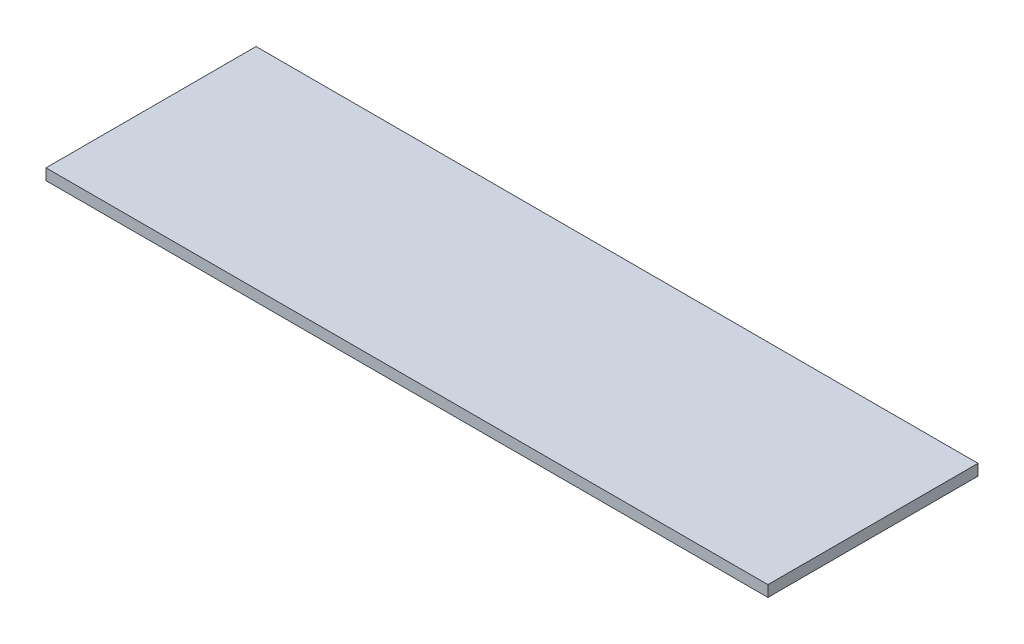
ISO-10303-21;
HEADER;
FILE_DESCRIPTION(('STEP AP214'),'2;1');
FILE_NAME('part.step','',(''),(''),'','','');
FILE_SCHEMA(('AUTOMOTIVE_DESIGN { 1 0 10303 214 1 1 1 1 }'));
ENDSEC;
DATA;
#1=APPLICATION_CONTEXT('core data for automotive mechanical design processes');
#2=APPLICATION_PROTOCOL_DEFINITION('international standard','automotive_design',2000,#1);
#3=PRODUCT_CONTEXT('',#1,'mechanical');
#4=PRODUCT('Part','Part','',(#3));
#5=PRODUCT_RELATED_PRODUCT_CATEGORY('part','',(#4));
#6=PRODUCT_DEFINITION_FORMATION('','',#4);
#7=PRODUCT_DEFINITION_CONTEXT('part definition',#1,'design');
#8=PRODUCT_DEFINITION('design','',#6,#7);
#9=PRODUCT_DEFINITION_SHAPE('','',#8);
#10=(LENGTH_UNIT() NAMED_UNIT(*) SI_UNIT(.MILLI.,.METRE.));
#11=(NAMED_UNIT(*) PLANE_ANGLE_UNIT() SI_UNIT($,.RADIAN.));
#12=(NAMED_UNIT(*) SI_UNIT($,.STERADIAN.) SOLID_ANGLE_UNIT());
#13=UNCERTAINTY_MEASURE_WITH_UNIT(LENGTH_MEASURE(1.E-05),#10,'distance_accuracy_value','');
#14=(GEOMETRIC_REPRESENTATION_CONTEXT(3) GLOBAL_UNCERTAINTY_ASSIGNED_CONTEXT((#13)) GLOBAL_UNIT_ASSIGNED_CONTEXT((#10,
#11,#12)) REPRESENTATION_CONTEXT('',''));
#15=CARTESIAN_POINT('',(0.,0.,0.));
#16=DIRECTION('',(0.,0.,1.));
#17=DIRECTION('',(1.,0.,0.));
#18=AXIS2_PLACEMENT_3D('',#15,#16,#17);
#19=CARTESIAN_POINT('',(-59.1289481870498,4.7625,-61.5154815794485));
#20=DIRECTION('',(1.,0.,0.));
#21=DIRECTION('',(0.,0.,-1.));
#22=AXIS2_PLACEMENT_3D('',#19,#20,#21);
#23=PLANE('',#22);
#24=DIRECTION('',(0.,0.,1.));
#25=VECTOR('',#24,1.);
#26=CARTESIAN_POINT('',(-59.1289481870498,0.,-61.5154815794485));
#27=LINE('',#26,#25);
#28=CARTESIAN_POINT('',(-59.1289481870498,0.,-61.5154815794485));
#29=VERTEX_POINT('',#28);
#30=CARTESIAN_POINT('',(-59.1289481870498,0.,28.4005184205515));
#31=VERTEX_POINT('',#30);
#32=EDGE_CURVE('E98',#29,#31,#27,.T.);
#33=ORIENTED_EDGE('',*,*,#32,.T.);
#34=DIRECTION('',(0.,-1.,0.));
#35=VECTOR('',#34,1.);
#36=CARTESIAN_POINT('',(-59.1289481870498,4.7625,28.4005184205515));
#37=LINE('',#36,#35);
#38=CARTESIAN_POINT('',(-59.1289481870498,4.7625,28.4005184205515));
#39=VERTEX_POINT('',#38);
#40=EDGE_CURVE('E11',#39,#31,#37,.T.);
#41=ORIENTED_EDGE('',*,*,#40,.F.);
#42=DIRECTION('',(0.,0.,1.));
#43=VECTOR('',#42,1.);
#44=CARTESIAN_POINT('',(-59.1289481870498,4.7625,-61.5154815794485));
#45=LINE('',#44,#43);
#46=CARTESIAN_POINT('',(-59.1289481870498,4.7625,-61.5154815794485));
#47=VERTEX_POINT('',#46);
#48=EDGE_CURVE('E86',#47,#39,#45,.T.);
#49=ORIENTED_EDGE('',*,*,#48,.F.);
#50=DIRECTION('',(0.,-1.,0.));
#51=VECTOR('',#50,1.);
#52=CARTESIAN_POINT('',(-59.1289481870498,4.7625,-61.5154815794485));
#53=LINE('',#52,#51);
#54=EDGE_CURVE('E94',#47,#29,#53,.T.);
#55=ORIENTED_EDGE('',*,*,#54,.T.);
#56=EDGE_LOOP('',(#33,#41,#49,#55));
#57=FACE_BOUND('',#56,.T.);
#58=ADVANCED_FACE('F35',(#57),#23,.F.);
#59=CARTESIAN_POINT('',(-59.1289481870498,4.7625,28.4005184205515));
#60=DIRECTION('',(0.,0.,-1.));
#61=DIRECTION('',(-1.,0.,0.));
#62=AXIS2_PLACEMENT_3D('',#59,#60,#61);
#63=PLANE('',#62);
#64=DIRECTION('',(1.,0.,0.));
#65=VECTOR('',#64,1.);
#66=CARTESIAN_POINT('',(-59.1289481870498,0.,28.4005184205515));
#67=LINE('',#66,#65);
#68=CARTESIAN_POINT('',(249.87105181295,0.,28.4005184205515));
#69=VERTEX_POINT('',#68);
#70=EDGE_CURVE('E90',#31,#69,#67,.T.);
#71=ORIENTED_EDGE('',*,*,#70,.T.);
#72=DIRECTION('',(0.,-1.,0.));
#73=VECTOR('',#72,1.);
#74=CARTESIAN_POINT('',(249.87105181295,4.7625,28.4005184205515));
#75=LINE('',#74,#73);
#76=CARTESIAN_POINT('',(249.87105181295,4.7625,28.4005184205515));
#77=VERTEX_POINT('',#76);
#78=EDGE_CURVE('E43',#77,#69,#75,.T.);
#79=ORIENTED_EDGE('',*,*,#78,.F.);
#80=DIRECTION('',(1.,0.,0.));
#81=VECTOR('',#80,1.);
#82=CARTESIAN_POINT('',(-59.1289481870498,4.7625,28.4005184205515));
#83=LINE('',#82,#81);
#84=EDGE_CURVE('E81',#39,#77,#83,.T.);
#85=ORIENTED_EDGE('',*,*,#84,.F.);
#86=ORIENTED_EDGE('',*,*,#40,.T.);
#87=EDGE_LOOP('',(#71,#79,#85,#86));
#88=FACE_BOUND('',#87,.T.);
#89=ADVANCED_FACE('F89',(#88),#63,.F.);
#90=CARTESIAN_POINT('',(249.87105181295,4.7625,-61.5154815794485));
#91=DIRECTION('',(-1.,0.,0.));
#92=DIRECTION('',(0.,0.,1.));
#93=AXIS2_PLACEMENT_3D('',#90,#91,#92);
#94=PLANE('',#93);
#95=DIRECTION('',(0.,0.,-1.));
#96=VECTOR('',#95,1.);
#97=CARTESIAN_POINT('',(249.87105181295,0.,-61.5154815794485));
#98=LINE('',#97,#96);
#99=CARTESIAN_POINT('',(249.87105181295,0.,-61.5154815794485));
#100=VERTEX_POINT('',#99);
#101=EDGE_CURVE('E68',#69,#100,#98,.T.);
#102=ORIENTED_EDGE('',*,*,#101,.T.);
#103=DIRECTION('',(0.,-1.,0.));
#104=VECTOR('',#103,1.);
#105=CARTESIAN_POINT('',(249.87105181295,4.7625,-61.5154815794485));
#106=LINE('',#105,#104);
#107=CARTESIAN_POINT('',(249.87105181295,4.7625,-61.5154815794485));
#108=VERTEX_POINT('',#107);
#109=EDGE_CURVE('E91',#108,#100,#106,.T.);
#110=ORIENTED_EDGE('',*,*,#109,.F.);
#111=DIRECTION('',(0.,0.,-1.));
#112=VECTOR('',#111,1.);
#113=CARTESIAN_POINT('',(249.87105181295,4.7625,-61.5154815794485));
#114=LINE('',#113,#112);
#115=EDGE_CURVE('E84',#77,#108,#114,.T.);
#116=ORIENTED_EDGE('',*,*,#115,.F.);
#117=ORIENTED_EDGE('',*,*,#78,.T.);
#118=EDGE_LOOP('',(#102,#110,#116,#117));
#119=FACE_BOUND('',#118,.T.);
#120=ADVANCED_FACE('F92',(#119),#94,.F.);
#121=CARTESIAN_POINT('',(-59.1289481870498,4.7625,-61.5154815794485));
#122=DIRECTION('',(0.,0.,1.));
#123=DIRECTION('',(1.,0.,0.));
#124=AXIS2_PLACEMENT_3D('',#121,#122,#123);
#125=PLANE('',#124);
#126=DIRECTION('',(-1.,0.,0.));
#127=VECTOR('',#126,1.);
#128=CARTESIAN_POINT('',(-59.1289481870498,0.,-61.5154815794485));
#129=LINE('',#128,#127);
#130=EDGE_CURVE('E74',#100,#29,#129,.T.);
#131=ORIENTED_EDGE('',*,*,#130,.T.);
#132=ORIENTED_EDGE('',*,*,#54,.F.);
#133=DIRECTION('',(-1.,0.,0.));
#134=VECTOR('',#133,1.);
#135=CARTESIAN_POINT('',(-59.1289481870498,4.7625,-61.5154815794485));
#136=LINE('',#135,#134);
#137=EDGE_CURVE('E51',#108,#47,#136,.T.);
#138=ORIENTED_EDGE('',*,*,#137,.F.);
#139=ORIENTED_EDGE('',*,*,#109,.T.);
#140=EDGE_LOOP('',(#131,#132,#138,#139));
#141=FACE_BOUND('',#140,.T.);
#142=ADVANCED_FACE('F105',(#141),#125,.F.);
#143=CARTESIAN_POINT('',(0.,4.7625,0.));
#144=DIRECTION('',(0.,1.,0.));
#145=DIRECTION('',(0.,0.,1.));
#146=AXIS2_PLACEMENT_3D('',#143,#144,#145);
#147=PLANE('',#146);
#148=ORIENTED_EDGE('',*,*,#48,.T.);
#149=ORIENTED_EDGE('',*,*,#84,.T.);
#150=ORIENTED_EDGE('',*,*,#115,.T.);
#151=ORIENTED_EDGE('',*,*,#137,.T.);
#152=EDGE_LOOP('',(#148,#149,#150,#151));
#153=FACE_BOUND('',#152,.T.);
#154=ADVANCED_FACE('F82',(#153),#147,.T.);
#155=CARTESIAN_POINT('',(0.,0.,0.));
#156=DIRECTION('',(0.,1.,0.));
#157=DIRECTION('',(0.,0.,1.));
#158=AXIS2_PLACEMENT_3D('',#155,#156,#157);
#159=PLANE('',#158);
#160=ORIENTED_EDGE('',*,*,#32,.F.);
#161=ORIENTED_EDGE('',*,*,#130,.F.);
#162=ORIENTED_EDGE('',*,*,#101,.F.);
#163=ORIENTED_EDGE('',*,*,#70,.F.);
#164=EDGE_LOOP('',(#160,#161,#162,#163));
#165=FACE_BOUND('',#164,.T.);
#166=ADVANCED_FACE('F108',(#165),#159,.F.);
#167=CLOSED_SHELL('',(#58,#89,#120,#142,#154,#166));
#168=MANIFOLD_SOLID_BREP('B2',#167);
#169=ADVANCED_BREP_SHAPE_REPRESENTATION('',(#18,#168),#14);
#170=SHAPE_DEFINITION_REPRESENTATION(#9,#169);
ENDSEC;
END-ISO-10303-21;
